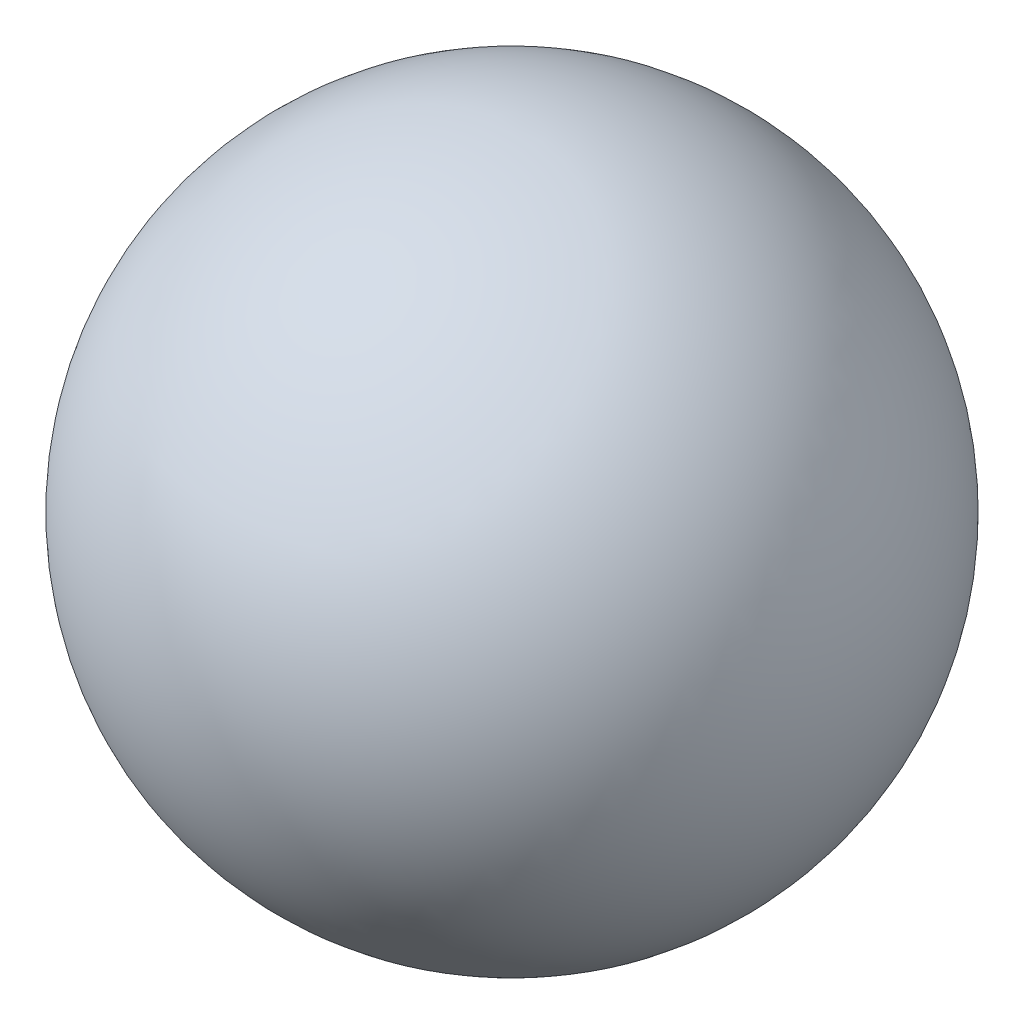
ISO-10303-21;
HEADER;
FILE_DESCRIPTION(('STEP AP214'),'2;1');
FILE_NAME('part.step','',(''),(''),'','','');
FILE_SCHEMA(('AUTOMOTIVE_DESIGN { 1 0 10303 214 1 1 1 1 }'));
ENDSEC;
DATA;
#1=APPLICATION_CONTEXT('core data for automotive mechanical design processes');
#2=APPLICATION_PROTOCOL_DEFINITION('international standard','automotive_design',2000,#1);
#3=PRODUCT_CONTEXT('',#1,'mechanical');
#4=PRODUCT('Part','Part','',(#3));
#5=PRODUCT_RELATED_PRODUCT_CATEGORY('part','',(#4));
#6=PRODUCT_DEFINITION_FORMATION('','',#4);
#7=PRODUCT_DEFINITION_CONTEXT('part definition',#1,'design');
#8=PRODUCT_DEFINITION('design','',#6,#7);
#9=PRODUCT_DEFINITION_SHAPE('','',#8);
#10=(LENGTH_UNIT() NAMED_UNIT(*) SI_UNIT(.MILLI.,.METRE.));
#11=(NAMED_UNIT(*) PLANE_ANGLE_UNIT() SI_UNIT($,.RADIAN.));
#12=(NAMED_UNIT(*) SI_UNIT($,.STERADIAN.) SOLID_ANGLE_UNIT());
#13=UNCERTAINTY_MEASURE_WITH_UNIT(LENGTH_MEASURE(1.E-05),#10,'distance_accuracy_value','');
#14=(GEOMETRIC_REPRESENTATION_CONTEXT(3) GLOBAL_UNCERTAINTY_ASSIGNED_CONTEXT((#13)) GLOBAL_UNIT_ASSIGNED_CONTEXT((#10,
#11,#12)) REPRESENTATION_CONTEXT('',''));
#15=CARTESIAN_POINT('',(0.,0.,0.));
#16=DIRECTION('',(0.,0.,1.));
#17=DIRECTION('',(1.,0.,0.));
#18=AXIS2_PLACEMENT_3D('',#15,#16,#17);
#19=CARTESIAN_POINT('',(0.,0.,0.));
#20=DIRECTION('',(0.,-1.,0.));
#21=DIRECTION('',(-1.,0.,0.));
#22=AXIS2_PLACEMENT_3D('',#19,#20,#21);
#23=SPHERICAL_SURFACE('',#22,0.8);
#24=CARTESIAN_POINT('',(0.,-0.8,0.));
#25=VERTEX_POINT('',#24);
#26=VERTEX_LOOP('',#25);
#27=FACE_BOUND('',#26,.T.);
#28=ADVANCED_FACE('F29',(#27),#23,.T.);
#29=CLOSED_SHELL('',(#28));
#30=MANIFOLD_SOLID_BREP('B2',#29);
#31=ADVANCED_BREP_SHAPE_REPRESENTATION('',(#18,#30),#14);
#32=SHAPE_DEFINITION_REPRESENTATION(#9,#31);
ENDSEC;
END-ISO-10303-21;
